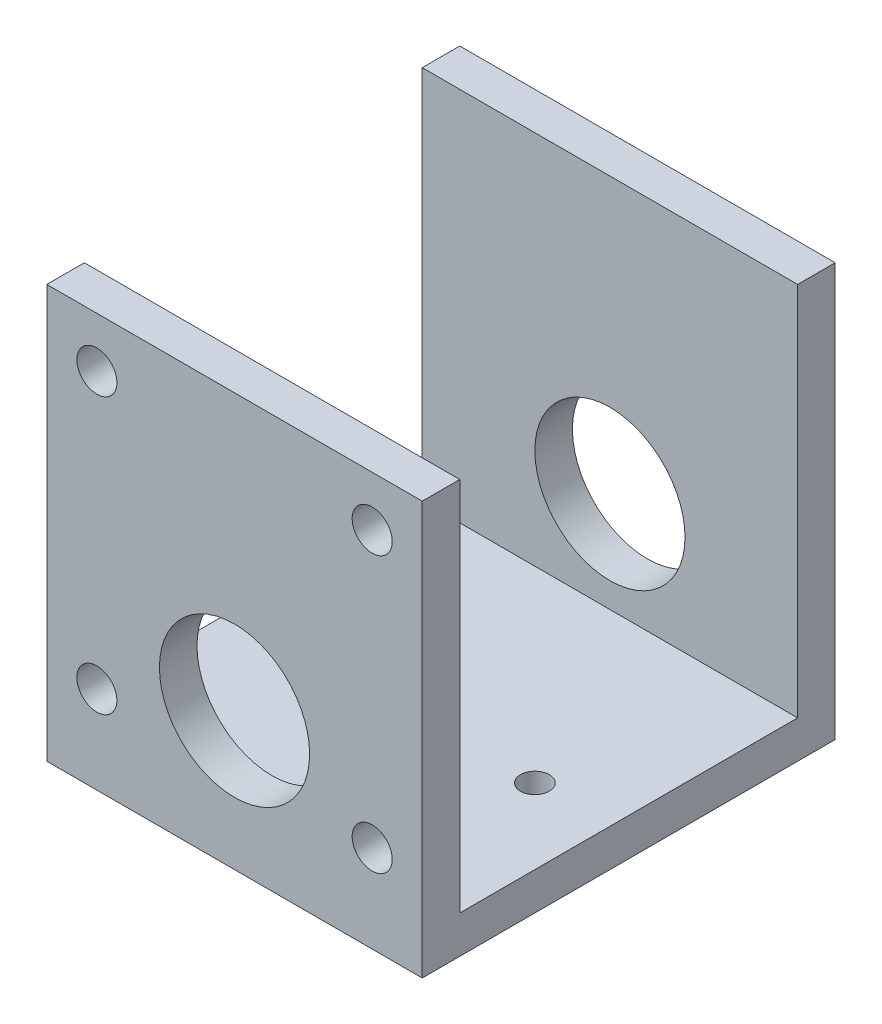
ISO-10303-21;
HEADER;
FILE_DESCRIPTION(('STEP AP214'),'2;1');
FILE_NAME('part.step','',(''),(''),'','','');
FILE_SCHEMA(('AUTOMOTIVE_DESIGN { 1 0 10303 214 1 1 1 1 }'));
ENDSEC;
DATA;
#1=APPLICATION_CONTEXT('core data for automotive mechanical design processes');
#2=APPLICATION_PROTOCOL_DEFINITION('international standard','automotive_design',2000,#1);
#3=PRODUCT_CONTEXT('',#1,'mechanical');
#4=PRODUCT('Part','Part','',(#3));
#5=PRODUCT_RELATED_PRODUCT_CATEGORY('part','',(#4));
#6=PRODUCT_DEFINITION_FORMATION('','',#4);
#7=PRODUCT_DEFINITION_CONTEXT('part definition',#1,'design');
#8=PRODUCT_DEFINITION('design','',#6,#7);
#9=PRODUCT_DEFINITION_SHAPE('','',#8);
#10=(LENGTH_UNIT() NAMED_UNIT(*) SI_UNIT(.MILLI.,.METRE.));
#11=(NAMED_UNIT(*) PLANE_ANGLE_UNIT() SI_UNIT($,.RADIAN.));
#12=(NAMED_UNIT(*) SI_UNIT($,.STERADIAN.) SOLID_ANGLE_UNIT());
#13=UNCERTAINTY_MEASURE_WITH_UNIT(LENGTH_MEASURE(1.E-05),#10,'distance_accuracy_value','');
#14=(GEOMETRIC_REPRESENTATION_CONTEXT(3) GLOBAL_UNCERTAINTY_ASSIGNED_CONTEXT((#13)) GLOBAL_UNIT_ASSIGNED_CONTEXT((#10,
#11,#12)) REPRESENTATION_CONTEXT('',''));
#15=CARTESIAN_POINT('',(0.,0.,0.));
#16=DIRECTION('',(0.,0.,1.));
#17=DIRECTION('',(1.,0.,0.));
#18=AXIS2_PLACEMENT_3D('',#15,#16,#17);
#19=CARTESIAN_POINT('',(0.,3.,0.));
#20=DIRECTION('',(0.,-1.,0.));
#21=DIRECTION('',(0.,0.,-1.));
#22=AXIS2_PLACEMENT_3D('',#19,#20,#21);
#23=PLANE('',#22);
#24=CARTESIAN_POINT('',(23.999988,3.,-12.));
#25=DIRECTION('',(0.,1.,0.));
#26=DIRECTION('',(0.,0.,1.));
#27=AXIS2_PLACEMENT_3D('',#24,#25,#26);
#28=CIRCLE('',#27,1.15);
#29=CARTESIAN_POINT('',(23.999988,3.,-10.85));
#30=VERTEX_POINT('',#29);
#31=EDGE_CURVE('E179',#30,#30,#28,.T.);
#32=ORIENTED_EDGE('',*,*,#31,.F.);
#33=EDGE_LOOP('',(#32));
#34=FACE_BOUND('',#33,.T.);
#35=CARTESIAN_POINT('',(5.999988,3.,-12.));
#36=DIRECTION('',(0.,1.,0.));
#37=DIRECTION('',(0.,0.,1.));
#38=AXIS2_PLACEMENT_3D('',#35,#36,#37);
#39=CIRCLE('',#38,1.15);
#40=CARTESIAN_POINT('',(5.999988,3.,-10.85));
#41=VERTEX_POINT('',#40);
#42=EDGE_CURVE('E187',#41,#41,#39,.T.);
#43=ORIENTED_EDGE('',*,*,#42,.F.);
#44=EDGE_LOOP('',(#43));
#45=FACE_BOUND('',#44,.T.);
#46=DIRECTION('',(1.,0.,0.));
#47=VECTOR('',#46,1.);
#48=CARTESIAN_POINT('',(30.,3.,-27.));
#49=LINE('',#48,#47);
#50=CARTESIAN_POINT('',(0.,3.,-27.));
#51=VERTEX_POINT('',#50);
#52=CARTESIAN_POINT('',(30.,3.,-27.));
#53=VERTEX_POINT('',#52);
#54=EDGE_CURVE('E59',#51,#53,#49,.T.);
#55=ORIENTED_EDGE('',*,*,#54,.F.);
#56=DIRECTION('',(0.,0.,1.));
#57=VECTOR('',#56,1.);
#58=CARTESIAN_POINT('',(0.,3.,0.));
#59=LINE('',#58,#57);
#60=CARTESIAN_POINT('',(0.,3.,0.));
#61=VERTEX_POINT('',#60);
#62=EDGE_CURVE('E195',#51,#61,#59,.T.);
#63=ORIENTED_EDGE('',*,*,#62,.T.);
#64=DIRECTION('',(1.,0.,0.));
#65=VECTOR('',#64,1.);
#66=CARTESIAN_POINT('',(0.,3.,0.));
#67=LINE('',#66,#65);
#68=CARTESIAN_POINT('',(30.,3.,0.));
#69=VERTEX_POINT('',#68);
#70=EDGE_CURVE('E198',#61,#69,#67,.T.);
#71=ORIENTED_EDGE('',*,*,#70,.T.);
#72=DIRECTION('',(0.,0.,-1.));
#73=VECTOR('',#72,1.);
#74=CARTESIAN_POINT('',(30.,3.,0.));
#75=LINE('',#74,#73);
#76=EDGE_CURVE('E202',#69,#53,#75,.T.);
#77=ORIENTED_EDGE('',*,*,#76,.T.);
#78=EDGE_LOOP('',(#55,#63,#71,#77));
#79=FACE_BOUND('',#78,.T.);
#80=ADVANCED_FACE('F43',(#34,#45,#79),#23,.F.);
#81=CARTESIAN_POINT('',(0.,0.,0.));
#82=DIRECTION('',(0.,-1.,0.));
#83=DIRECTION('',(0.,0.,-1.));
#84=AXIS2_PLACEMENT_3D('',#81,#82,#83);
#85=PLANE('',#84);
#86=CARTESIAN_POINT('',(5.999988,0.,-12.));
#87=DIRECTION('',(0.,1.,0.));
#88=DIRECTION('',(0.,0.,1.));
#89=AXIS2_PLACEMENT_3D('',#86,#87,#88);
#90=CIRCLE('',#89,1.15);
#91=CARTESIAN_POINT('',(5.999988,0.,-10.85));
#92=VERTEX_POINT('',#91);
#93=EDGE_CURVE('E183',#92,#92,#90,.T.);
#94=ORIENTED_EDGE('',*,*,#93,.T.);
#95=EDGE_LOOP('',(#94));
#96=FACE_BOUND('',#95,.T.);
#97=DIRECTION('',(0.,0.,1.));
#98=VECTOR('',#97,1.);
#99=CARTESIAN_POINT('',(0.,0.,0.));
#100=LINE('',#99,#98);
#101=CARTESIAN_POINT('',(0.,0.,-30.));
#102=VERTEX_POINT('',#101);
#103=CARTESIAN_POINT('',(0.,0.,3.));
#104=VERTEX_POINT('',#103);
#105=EDGE_CURVE('E191',#102,#104,#100,.T.);
#106=ORIENTED_EDGE('',*,*,#105,.F.);
#107=DIRECTION('',(-1.,0.,0.));
#108=VECTOR('',#107,1.);
#109=CARTESIAN_POINT('',(0.,0.,-30.));
#110=LINE('',#109,#108);
#111=CARTESIAN_POINT('',(30.,0.,-30.));
#112=VERTEX_POINT('',#111);
#113=EDGE_CURVE('E199',#112,#102,#110,.T.);
#114=ORIENTED_EDGE('',*,*,#113,.F.);
#115=DIRECTION('',(0.,0.,-1.));
#116=VECTOR('',#115,1.);
#117=CARTESIAN_POINT('',(30.,0.,0.));
#118=LINE('',#117,#116);
#119=CARTESIAN_POINT('',(30.,0.,3.));
#120=VERTEX_POINT('',#119);
#121=EDGE_CURVE('E82',#120,#112,#118,.T.);
#122=ORIENTED_EDGE('',*,*,#121,.F.);
#123=DIRECTION('',(1.,0.,0.));
#124=VECTOR('',#123,1.);
#125=CARTESIAN_POINT('',(30.,0.,3.));
#126=LINE('',#125,#124);
#127=EDGE_CURVE('E136',#104,#120,#126,.T.);
#128=ORIENTED_EDGE('',*,*,#127,.F.);
#129=EDGE_LOOP('',(#106,#114,#122,#128));
#130=FACE_BOUND('',#129,.T.);
#131=CARTESIAN_POINT('',(23.999988,0.,-12.));
#132=DIRECTION('',(0.,1.,0.));
#133=DIRECTION('',(0.,0.,1.));
#134=AXIS2_PLACEMENT_3D('',#131,#132,#133);
#135=CIRCLE('',#134,1.15);
#136=CARTESIAN_POINT('',(23.999988,0.,-10.85));
#137=VERTEX_POINT('',#136);
#138=EDGE_CURVE('E178',#137,#137,#135,.T.);
#139=ORIENTED_EDGE('',*,*,#138,.T.);
#140=EDGE_LOOP('',(#139));
#141=FACE_BOUND('',#140,.T.);
#142=ADVANCED_FACE('F220',(#96,#130,#141),#85,.T.);
#143=CARTESIAN_POINT('',(0.,3.,0.));
#144=DIRECTION('',(1.,0.,0.));
#145=DIRECTION('',(0.,0.,-1.));
#146=AXIS2_PLACEMENT_3D('',#143,#144,#145);
#147=PLANE('',#146);
#148=ORIENTED_EDGE('',*,*,#105,.T.);
#149=DIRECTION('',(0.,-1.,0.));
#150=VECTOR('',#149,1.);
#151=CARTESIAN_POINT('',(0.,0.,3.));
#152=LINE('',#151,#150);
#153=CARTESIAN_POINT('',(0.,33.,3.));
#154=VERTEX_POINT('',#153);
#155=EDGE_CURVE('E129',#154,#104,#152,.T.);
#156=ORIENTED_EDGE('',*,*,#155,.F.);
#157=DIRECTION('',(0.,0.,-1.));
#158=VECTOR('',#157,1.);
#159=CARTESIAN_POINT('',(0.,33.,3.));
#160=LINE('',#159,#158);
#161=CARTESIAN_POINT('',(0.,33.,0.));
#162=VERTEX_POINT('',#161);
#163=EDGE_CURVE('E124',#154,#162,#160,.T.);
#164=ORIENTED_EDGE('',*,*,#163,.T.);
#165=DIRECTION('',(0.,-1.,0.));
#166=VECTOR('',#165,1.);
#167=CARTESIAN_POINT('',(0.,0.,0.));
#168=LINE('',#167,#166);
#169=EDGE_CURVE('E138',#162,#61,#168,.T.);
#170=ORIENTED_EDGE('',*,*,#169,.T.);
#171=ORIENTED_EDGE('',*,*,#62,.F.);
#172=DIRECTION('',(0.,-1.,0.));
#173=VECTOR('',#172,1.);
#174=CARTESIAN_POINT('',(0.,33.,-27.));
#175=LINE('',#174,#173);
#176=CARTESIAN_POINT('',(0.,33.,-27.));
#177=VERTEX_POINT('',#176);
#178=EDGE_CURVE('E174',#177,#51,#175,.T.);
#179=ORIENTED_EDGE('',*,*,#178,.F.);
#180=DIRECTION('',(0.,0.,1.));
#181=VECTOR('',#180,1.);
#182=CARTESIAN_POINT('',(0.,33.,-30.));
#183=LINE('',#182,#181);
#184=CARTESIAN_POINT('',(0.,33.,-30.));
#185=VERTEX_POINT('',#184);
#186=EDGE_CURVE('E163',#185,#177,#183,.T.);
#187=ORIENTED_EDGE('',*,*,#186,.F.);
#188=DIRECTION('',(0.,-1.,0.));
#189=VECTOR('',#188,1.);
#190=CARTESIAN_POINT('',(0.,3.,-30.));
#191=LINE('',#190,#189);
#192=EDGE_CURVE('E52',#185,#102,#191,.T.);
#193=ORIENTED_EDGE('',*,*,#192,.T.);
#194=EDGE_LOOP('',(#148,#156,#164,#170,#171,#179,#187,#193));
#195=FACE_BOUND('',#194,.T.);
#196=ADVANCED_FACE('F45',(#195),#147,.F.);
#197=CARTESIAN_POINT('',(30.,3.,0.));
#198=DIRECTION('',(-1.,0.,0.));
#199=DIRECTION('',(0.,0.,1.));
#200=AXIS2_PLACEMENT_3D('',#197,#198,#199);
#201=PLANE('',#200);
#202=ORIENTED_EDGE('',*,*,#121,.T.);
#203=DIRECTION('',(0.,-1.,0.));
#204=VECTOR('',#203,1.);
#205=CARTESIAN_POINT('',(30.,3.,-30.));
#206=LINE('',#205,#204);
#207=CARTESIAN_POINT('',(30.,33.,-30.));
#208=VERTEX_POINT('',#207);
#209=EDGE_CURVE('E11',#208,#112,#206,.T.);
#210=ORIENTED_EDGE('',*,*,#209,.F.);
#211=DIRECTION('',(0.,0.,-1.));
#212=VECTOR('',#211,1.);
#213=CARTESIAN_POINT('',(30.,33.,-30.));
#214=LINE('',#213,#212);
#215=CARTESIAN_POINT('',(30.,33.,-27.));
#216=VERTEX_POINT('',#215);
#217=EDGE_CURVE('E156',#216,#208,#214,.T.);
#218=ORIENTED_EDGE('',*,*,#217,.F.);
#219=DIRECTION('',(0.,-1.,0.));
#220=VECTOR('',#219,1.);
#221=CARTESIAN_POINT('',(30.,33.,-27.));
#222=LINE('',#221,#220);
#223=EDGE_CURVE('E168',#216,#53,#222,.T.);
#224=ORIENTED_EDGE('',*,*,#223,.T.);
#225=ORIENTED_EDGE('',*,*,#76,.F.);
#226=DIRECTION('',(0.,1.,0.));
#227=VECTOR('',#226,1.);
#228=CARTESIAN_POINT('',(30.,0.,0.));
#229=LINE('',#228,#227);
#230=CARTESIAN_POINT('',(30.,33.,0.));
#231=VERTEX_POINT('',#230);
#232=EDGE_CURVE('E68',#69,#231,#229,.T.);
#233=ORIENTED_EDGE('',*,*,#232,.T.);
#234=DIRECTION('',(0.,0.,-1.));
#235=VECTOR('',#234,1.);
#236=CARTESIAN_POINT('',(30.,33.,3.));
#237=LINE('',#236,#235);
#238=CARTESIAN_POINT('',(30.,33.,3.));
#239=VERTEX_POINT('',#238);
#240=EDGE_CURVE('E122',#239,#231,#237,.T.);
#241=ORIENTED_EDGE('',*,*,#240,.F.);
#242=DIRECTION('',(0.,1.,0.));
#243=VECTOR('',#242,1.);
#244=CARTESIAN_POINT('',(30.,0.,3.));
#245=LINE('',#244,#243);
#246=EDGE_CURVE('E130',#120,#239,#245,.T.);
#247=ORIENTED_EDGE('',*,*,#246,.F.);
#248=EDGE_LOOP('',(#202,#210,#218,#224,#225,#233,#241,#247));
#249=FACE_BOUND('',#248,.T.);
#250=ADVANCED_FACE('F140',(#249),#201,.F.);
#251=CARTESIAN_POINT('',(0.,3.,-30.));
#252=DIRECTION('',(0.,0.,1.));
#253=DIRECTION('',(1.,0.,0.));
#254=AXIS2_PLACEMENT_3D('',#251,#252,#253);
#255=PLANE('',#254);
#256=CARTESIAN_POINT('',(15.,11.,-30.));
#257=DIRECTION('',(0.,0.,-1.));
#258=DIRECTION('',(-1.,0.,0.));
#259=AXIS2_PLACEMENT_3D('',#256,#257,#258);
#260=CIRCLE('',#259,6.);
#261=CARTESIAN_POINT('',(9.,11.,-30.));
#262=VERTEX_POINT('',#261);
#263=EDGE_CURVE('E143',#262,#262,#260,.T.);
#264=ORIENTED_EDGE('',*,*,#263,.F.);
#265=EDGE_LOOP('',(#264));
#266=FACE_BOUND('',#265,.T.);
#267=ORIENTED_EDGE('',*,*,#113,.T.);
#268=ORIENTED_EDGE('',*,*,#192,.F.);
#269=DIRECTION('',(-1.,0.,0.));
#270=VECTOR('',#269,1.);
#271=CARTESIAN_POINT('',(30.,33.,-30.));
#272=LINE('',#271,#270);
#273=EDGE_CURVE('E159',#208,#185,#272,.T.);
#274=ORIENTED_EDGE('',*,*,#273,.F.);
#275=ORIENTED_EDGE('',*,*,#209,.T.);
#276=EDGE_LOOP('',(#267,#268,#274,#275));
#277=FACE_BOUND('',#276,.T.);
#278=ADVANCED_FACE('F265',(#266,#277),#255,.F.);
#279=CARTESIAN_POINT('',(5.999988,3.,-12.));
#280=DIRECTION('',(0.,-1.,0.));
#281=DIRECTION('',(0.,0.,-1.));
#282=AXIS2_PLACEMENT_3D('',#279,#280,#281);
#283=CYLINDRICAL_SURFACE('',#282,1.15);
#284=ORIENTED_EDGE('',*,*,#42,.T.);
#285=EDGE_LOOP('',(#284));
#286=FACE_BOUND('',#285,.T.);
#287=ORIENTED_EDGE('',*,*,#93,.F.);
#288=EDGE_LOOP('',(#287));
#289=FACE_BOUND('',#288,.T.);
#290=ADVANCED_FACE('F249',(#286,#289),#283,.F.);
#291=CARTESIAN_POINT('',(23.999988,3.,-12.));
#292=DIRECTION('',(0.,-1.,0.));
#293=DIRECTION('',(0.,0.,-1.));
#294=AXIS2_PLACEMENT_3D('',#291,#292,#293);
#295=CYLINDRICAL_SURFACE('',#294,1.15);
#296=ORIENTED_EDGE('',*,*,#31,.T.);
#297=EDGE_LOOP('',(#296));
#298=FACE_BOUND('',#297,.T.);
#299=ORIENTED_EDGE('',*,*,#138,.F.);
#300=EDGE_LOOP('',(#299));
#301=FACE_BOUND('',#300,.T.);
#302=ADVANCED_FACE('F240',(#298,#301),#295,.F.);
#303=CARTESIAN_POINT('',(30.,33.,-27.));
#304=DIRECTION('',(0.,0.,-1.));
#305=DIRECTION('',(-1.,0.,0.));
#306=AXIS2_PLACEMENT_3D('',#303,#304,#305);
#307=PLANE('',#306);
#308=CARTESIAN_POINT('',(15.,11.,-27.));
#309=DIRECTION('',(0.,0.,-1.));
#310=DIRECTION('',(-1.,0.,0.));
#311=AXIS2_PLACEMENT_3D('',#308,#309,#310);
#312=CIRCLE('',#311,6.);
#313=CARTESIAN_POINT('',(9.,11.,-27.));
#314=VERTEX_POINT('',#313);
#315=EDGE_CURVE('E148',#314,#314,#312,.F.);
#316=ORIENTED_EDGE('',*,*,#315,.F.);
#317=EDGE_LOOP('',(#316));
#318=FACE_BOUND('',#317,.T.);
#319=ORIENTED_EDGE('',*,*,#54,.T.);
#320=ORIENTED_EDGE('',*,*,#223,.F.);
#321=DIRECTION('',(1.,0.,0.));
#322=VECTOR('',#321,1.);
#323=CARTESIAN_POINT('',(30.,33.,-27.));
#324=LINE('',#323,#322);
#325=EDGE_CURVE('E89',#177,#216,#324,.T.);
#326=ORIENTED_EDGE('',*,*,#325,.F.);
#327=ORIENTED_EDGE('',*,*,#178,.T.);
#328=EDGE_LOOP('',(#319,#320,#326,#327));
#329=FACE_BOUND('',#328,.T.);
#330=ADVANCED_FACE('F237',(#318,#329),#307,.F.);
#331=CARTESIAN_POINT('',(0.,33.,0.));
#332=DIRECTION('',(0.,-1.,0.));
#333=DIRECTION('',(0.,0.,-1.));
#334=AXIS2_PLACEMENT_3D('',#331,#332,#333);
#335=PLANE('',#334);
#336=ORIENTED_EDGE('',*,*,#217,.T.);
#337=ORIENTED_EDGE('',*,*,#273,.T.);
#338=ORIENTED_EDGE('',*,*,#186,.T.);
#339=ORIENTED_EDGE('',*,*,#325,.T.);
#340=EDGE_LOOP('',(#336,#337,#338,#339));
#341=FACE_BOUND('',#340,.T.);
#342=ADVANCED_FACE('F239',(#341),#335,.F.);
#343=CARTESIAN_POINT('',(15.,11.,0.001000000000001));
#344=DIRECTION('',(0.,0.,-1.));
#345=DIRECTION('',(-1.,0.,0.));
#346=AXIS2_PLACEMENT_3D('',#343,#344,#345);
#347=CYLINDRICAL_SURFACE('',#346,6.);
#348=ORIENTED_EDGE('',*,*,#263,.T.);
#349=EDGE_LOOP('',(#348));
#350=FACE_BOUND('',#349,.T.);
#351=ORIENTED_EDGE('',*,*,#315,.T.);
#352=EDGE_LOOP('',(#351));
#353=FACE_BOUND('',#352,.T.);
#354=ADVANCED_FACE('F247',(#350,#353),#347,.F.);
#355=CARTESIAN_POINT('',(0.,0.,3.));
#356=DIRECTION('',(0.,0.,1.));
#357=DIRECTION('',(1.,0.,0.));
#358=AXIS2_PLACEMENT_3D('',#355,#356,#357);
#359=PLANE('',#358);
#360=CARTESIAN_POINT('',(4.,7.,3.));
#361=DIRECTION('',(0.,0.,1.));
#362=DIRECTION('',(1.,0.,0.));
#363=AXIS2_PLACEMENT_3D('',#360,#361,#362);
#364=CIRCLE('',#363,1.6);
#365=CARTESIAN_POINT('',(5.6,7.,3.));
#366=VERTEX_POINT('',#365);
#367=EDGE_CURVE('E461',#366,#366,#364,.T.);
#368=ORIENTED_EDGE('',*,*,#367,.F.);
#369=EDGE_LOOP('',(#368));
#370=FACE_BOUND('',#369,.T.);
#371=CARTESIAN_POINT('',(26.,29.,3.));
#372=DIRECTION('',(0.,0.,1.));
#373=DIRECTION('',(1.,0.,0.));
#374=AXIS2_PLACEMENT_3D('',#371,#372,#373);
#375=CIRCLE('',#374,1.6);
#376=CARTESIAN_POINT('',(27.6,29.,3.));
#377=VERTEX_POINT('',#376);
#378=EDGE_CURVE('E477',#377,#377,#375,.T.);
#379=ORIENTED_EDGE('',*,*,#378,.F.);
#380=EDGE_LOOP('',(#379));
#381=FACE_BOUND('',#380,.T.);
#382=CARTESIAN_POINT('',(4.,29.,3.));
#383=DIRECTION('',(0.,0.,1.));
#384=DIRECTION('',(1.,0.,0.));
#385=AXIS2_PLACEMENT_3D('',#382,#383,#384);
#386=CIRCLE('',#385,1.6);
#387=CARTESIAN_POINT('',(5.6,29.,3.));
#388=VERTEX_POINT('',#387);
#389=EDGE_CURVE('E511',#388,#388,#386,.T.);
#390=ORIENTED_EDGE('',*,*,#389,.F.);
#391=EDGE_LOOP('',(#390));
#392=FACE_BOUND('',#391,.T.);
#393=CARTESIAN_POINT('',(26.,7.,3.));
#394=DIRECTION('',(0.,0.,1.));
#395=DIRECTION('',(1.,0.,0.));
#396=AXIS2_PLACEMENT_3D('',#393,#394,#395);
#397=CIRCLE('',#396,1.6);
#398=CARTESIAN_POINT('',(27.6,7.,3.));
#399=VERTEX_POINT('',#398);
#400=EDGE_CURVE('E471',#399,#399,#397,.T.);
#401=ORIENTED_EDGE('',*,*,#400,.F.);
#402=EDGE_LOOP('',(#401));
#403=FACE_BOUND('',#402,.T.);
#404=ORIENTED_EDGE('',*,*,#246,.T.);
#405=DIRECTION('',(-1.,0.,0.));
#406=VECTOR('',#405,1.);
#407=CARTESIAN_POINT('',(30.,33.,3.));
#408=LINE('',#407,#406);
#409=EDGE_CURVE('E118',#239,#154,#408,.T.);
#410=ORIENTED_EDGE('',*,*,#409,.T.);
#411=ORIENTED_EDGE('',*,*,#155,.T.);
#412=ORIENTED_EDGE('',*,*,#127,.T.);
#413=EDGE_LOOP('',(#404,#410,#411,#412));
#414=FACE_BOUND('',#413,.T.);
#415=CARTESIAN_POINT('',(15.,11.,3.));
#416=DIRECTION('',(0.,0.,1.));
#417=DIRECTION('',(1.,0.,0.));
#418=AXIS2_PLACEMENT_3D('',#415,#416,#417);
#419=CIRCLE('',#418,6.);
#420=CARTESIAN_POINT('',(21.,11.,3.));
#421=VERTEX_POINT('',#420);
#422=EDGE_CURVE('E230',#421,#421,#419,.T.);
#423=ORIENTED_EDGE('',*,*,#422,.F.);
#424=EDGE_LOOP('',(#423));
#425=FACE_BOUND('',#424,.T.);
#426=ADVANCED_FACE('F133',(#370,#381,#392,#403,#414,#425),#359,.T.);
#427=CARTESIAN_POINT('',(0.,0.,0.));
#428=DIRECTION('',(0.,0.,1.));
#429=DIRECTION('',(1.,0.,0.));
#430=AXIS2_PLACEMENT_3D('',#427,#428,#429);
#431=PLANE('',#430);
#432=CARTESIAN_POINT('',(4.,7.,0.));
#433=DIRECTION('',(0.,0.,1.));
#434=DIRECTION('',(1.,0.,0.));
#435=AXIS2_PLACEMENT_3D('',#432,#433,#434);
#436=CIRCLE('',#435,1.6);
#437=CARTESIAN_POINT('',(5.6,7.,0.));
#438=VERTEX_POINT('',#437);
#439=EDGE_CURVE('E464',#438,#438,#436,.F.);
#440=ORIENTED_EDGE('',*,*,#439,.F.);
#441=EDGE_LOOP('',(#440));
#442=FACE_BOUND('',#441,.T.);
#443=CARTESIAN_POINT('',(26.,29.,0.));
#444=DIRECTION('',(0.,0.,1.));
#445=DIRECTION('',(1.,0.,0.));
#446=AXIS2_PLACEMENT_3D('',#443,#444,#445);
#447=CIRCLE('',#446,1.6);
#448=CARTESIAN_POINT('',(27.6,29.,0.));
#449=VERTEX_POINT('',#448);
#450=EDGE_CURVE('E473',#449,#449,#447,.F.);
#451=ORIENTED_EDGE('',*,*,#450,.F.);
#452=EDGE_LOOP('',(#451));
#453=FACE_BOUND('',#452,.T.);
#454=CARTESIAN_POINT('',(4.,29.,0.));
#455=DIRECTION('',(0.,0.,1.));
#456=DIRECTION('',(1.,0.,0.));
#457=AXIS2_PLACEMENT_3D('',#454,#455,#456);
#458=CIRCLE('',#457,1.6);
#459=CARTESIAN_POINT('',(5.6,29.,0.));
#460=VERTEX_POINT('',#459);
#461=EDGE_CURVE('E481',#460,#460,#458,.F.);
#462=ORIENTED_EDGE('',*,*,#461,.F.);
#463=EDGE_LOOP('',(#462));
#464=FACE_BOUND('',#463,.T.);
#465=CARTESIAN_POINT('',(26.,7.,0.));
#466=DIRECTION('',(0.,0.,1.));
#467=DIRECTION('',(1.,0.,0.));
#468=AXIS2_PLACEMENT_3D('',#465,#466,#467);
#469=CIRCLE('',#468,1.6);
#470=CARTESIAN_POINT('',(27.6,7.,0.));
#471=VERTEX_POINT('',#470);
#472=EDGE_CURVE('E466',#471,#471,#469,.F.);
#473=ORIENTED_EDGE('',*,*,#472,.F.);
#474=EDGE_LOOP('',(#473));
#475=FACE_BOUND('',#474,.T.);
#476=ORIENTED_EDGE('',*,*,#70,.F.);
#477=ORIENTED_EDGE('',*,*,#169,.F.);
#478=DIRECTION('',(-1.,0.,0.));
#479=VECTOR('',#478,1.);
#480=CARTESIAN_POINT('',(30.,33.,0.));
#481=LINE('',#480,#479);
#482=EDGE_CURVE('E229',#231,#162,#481,.T.);
#483=ORIENTED_EDGE('',*,*,#482,.F.);
#484=ORIENTED_EDGE('',*,*,#232,.F.);
#485=EDGE_LOOP('',(#476,#477,#483,#484));
#486=FACE_BOUND('',#485,.T.);
#487=CARTESIAN_POINT('',(15.,11.,0.));
#488=DIRECTION('',(0.,0.,1.));
#489=DIRECTION('',(1.,0.,0.));
#490=AXIS2_PLACEMENT_3D('',#487,#488,#489);
#491=CIRCLE('',#490,6.);
#492=CARTESIAN_POINT('',(21.,11.,0.));
#493=VERTEX_POINT('',#492);
#494=EDGE_CURVE('E488',#493,#493,#491,.T.);
#495=ORIENTED_EDGE('',*,*,#494,.T.);
#496=EDGE_LOOP('',(#495));
#497=FACE_BOUND('',#496,.T.);
#498=ADVANCED_FACE('F373',(#442,#453,#464,#475,#486,#497),#431,.F.);
#499=CARTESIAN_POINT('',(30.,33.,3.));
#500=DIRECTION('',(0.,-1.,0.));
#501=DIRECTION('',(1.,0.,0.));
#502=AXIS2_PLACEMENT_3D('',#499,#500,#501);
#503=PLANE('',#502);
#504=ORIENTED_EDGE('',*,*,#482,.T.);
#505=ORIENTED_EDGE('',*,*,#163,.F.);
#506=ORIENTED_EDGE('',*,*,#409,.F.);
#507=ORIENTED_EDGE('',*,*,#240,.T.);
#508=EDGE_LOOP('',(#504,#505,#506,#507));
#509=FACE_BOUND('',#508,.T.);
#510=ADVANCED_FACE('F120',(#509),#503,.F.);
#511=CARTESIAN_POINT('',(15.,11.,3.));
#512=DIRECTION('',(0.,0.,-1.));
#513=DIRECTION('',(-1.,0.,0.));
#514=AXIS2_PLACEMENT_3D('',#511,#512,#513);
#515=CYLINDRICAL_SURFACE('',#514,6.);
#516=ORIENTED_EDGE('',*,*,#422,.T.);
#517=EDGE_LOOP('',(#516));
#518=FACE_BOUND('',#517,.T.);
#519=ORIENTED_EDGE('',*,*,#494,.F.);
#520=EDGE_LOOP('',(#519));
#521=FACE_BOUND('',#520,.T.);
#522=ADVANCED_FACE('F395',(#518,#521),#515,.F.);
#523=CARTESIAN_POINT('',(26.,7.,-30.001));
#524=DIRECTION('',(0.,0.,1.));
#525=DIRECTION('',(1.,0.,0.));
#526=AXIS2_PLACEMENT_3D('',#523,#524,#525);
#527=CYLINDRICAL_SURFACE('',#526,1.6);
#528=ORIENTED_EDGE('',*,*,#400,.T.);
#529=EDGE_LOOP('',(#528));
#530=FACE_BOUND('',#529,.T.);
#531=ORIENTED_EDGE('',*,*,#472,.T.);
#532=EDGE_LOOP('',(#531));
#533=FACE_BOUND('',#532,.T.);
#534=ADVANCED_FACE('F404',(#530,#533),#527,.F.);
#535=CARTESIAN_POINT('',(4.,29.,-30.001));
#536=DIRECTION('',(0.,0.,1.));
#537=DIRECTION('',(1.,0.,0.));
#538=AXIS2_PLACEMENT_3D('',#535,#536,#537);
#539=CYLINDRICAL_SURFACE('',#538,1.6);
#540=ORIENTED_EDGE('',*,*,#389,.T.);
#541=EDGE_LOOP('',(#540));
#542=FACE_BOUND('',#541,.T.);
#543=ORIENTED_EDGE('',*,*,#461,.T.);
#544=EDGE_LOOP('',(#543));
#545=FACE_BOUND('',#544,.T.);
#546=ADVANCED_FACE('F414',(#542,#545),#539,.F.);
#547=CARTESIAN_POINT('',(26.,29.,-30.001));
#548=DIRECTION('',(0.,0.,1.));
#549=DIRECTION('',(1.,0.,0.));
#550=AXIS2_PLACEMENT_3D('',#547,#548,#549);
#551=CYLINDRICAL_SURFACE('',#550,1.6);
#552=ORIENTED_EDGE('',*,*,#378,.T.);
#553=EDGE_LOOP('',(#552));
#554=FACE_BOUND('',#553,.T.);
#555=ORIENTED_EDGE('',*,*,#450,.T.);
#556=EDGE_LOOP('',(#555));
#557=FACE_BOUND('',#556,.T.);
#558=ADVANCED_FACE('F425',(#554,#557),#551,.F.);
#559=CARTESIAN_POINT('',(4.,7.,-30.001));
#560=DIRECTION('',(0.,0.,1.));
#561=DIRECTION('',(1.,0.,0.));
#562=AXIS2_PLACEMENT_3D('',#559,#560,#561);
#563=CYLINDRICAL_SURFACE('',#562,1.6);
#564=ORIENTED_EDGE('',*,*,#367,.T.);
#565=EDGE_LOOP('',(#564));
#566=FACE_BOUND('',#565,.T.);
#567=ORIENTED_EDGE('',*,*,#439,.T.);
#568=EDGE_LOOP('',(#567));
#569=FACE_BOUND('',#568,.T.);
#570=ADVANCED_FACE('F436',(#566,#569),#563,.F.);
#571=CLOSED_SHELL('',(#80,#142,#196,#250,#278,#290,#302,#330,#342,#354,#426,#498,#510,#522,#534,
#546,#558,#570));
#572=MANIFOLD_SOLID_BREP('B2',#571);
#573=ADVANCED_BREP_SHAPE_REPRESENTATION('',(#18,#572),#14);
#574=SHAPE_DEFINITION_REPRESENTATION(#9,#573);
ENDSEC;
END-ISO-10303-21;
